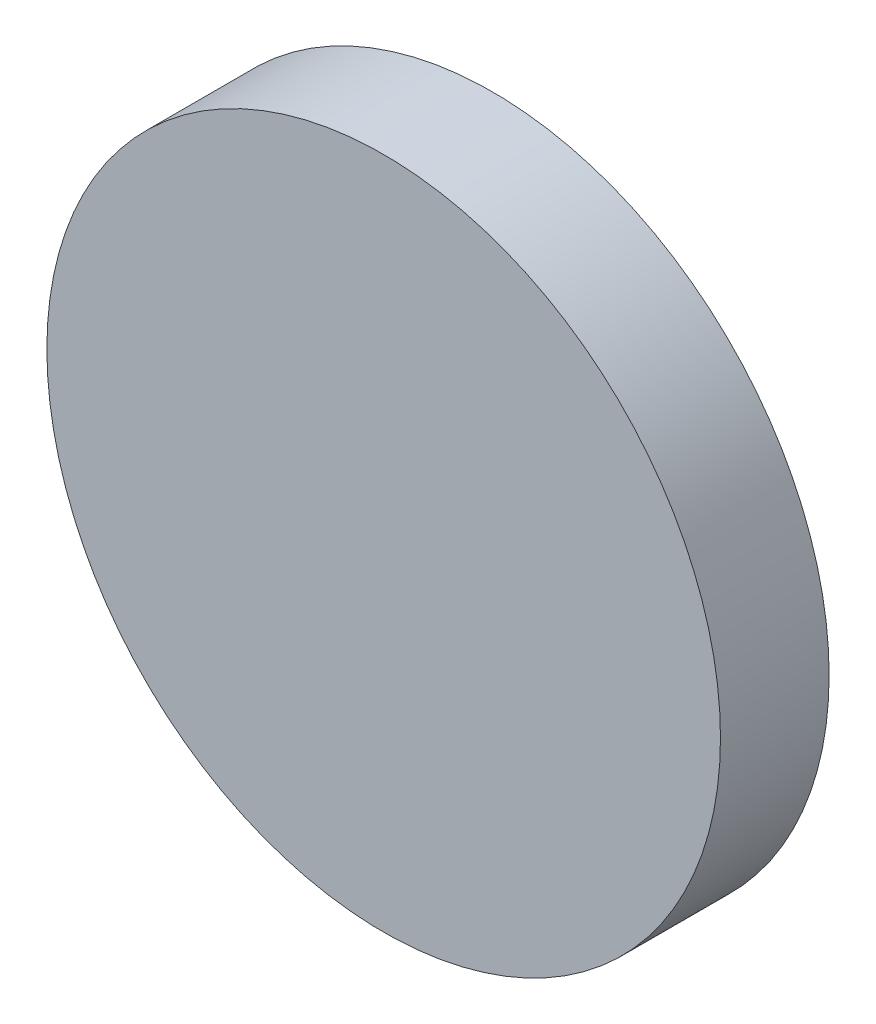
ISO-10303-21;
HEADER;
FILE_DESCRIPTION(('STEP AP214'),'2;1');
FILE_NAME('part.step','',(''),(''),'','','');
FILE_SCHEMA(('AUTOMOTIVE_DESIGN { 1 0 10303 214 1 1 1 1 }'));
ENDSEC;
DATA;
#1=APPLICATION_CONTEXT('core data for automotive mechanical design processes');
#2=APPLICATION_PROTOCOL_DEFINITION('international standard','automotive_design',2000,#1);
#3=PRODUCT_CONTEXT('',#1,'mechanical');
#4=PRODUCT('Part','Part','',(#3));
#5=PRODUCT_RELATED_PRODUCT_CATEGORY('part','',(#4));
#6=PRODUCT_DEFINITION_FORMATION('','',#4);
#7=PRODUCT_DEFINITION_CONTEXT('part definition',#1,'design');
#8=PRODUCT_DEFINITION('design','',#6,#7);
#9=PRODUCT_DEFINITION_SHAPE('','',#8);
#10=(LENGTH_UNIT() NAMED_UNIT(*) SI_UNIT(.MILLI.,.METRE.));
#11=(NAMED_UNIT(*) PLANE_ANGLE_UNIT() SI_UNIT($,.RADIAN.));
#12=(NAMED_UNIT(*) SI_UNIT($,.STERADIAN.) SOLID_ANGLE_UNIT());
#13=UNCERTAINTY_MEASURE_WITH_UNIT(LENGTH_MEASURE(1.E-05),#10,'distance_accuracy_value','');
#14=(GEOMETRIC_REPRESENTATION_CONTEXT(3) GLOBAL_UNCERTAINTY_ASSIGNED_CONTEXT((#13)) GLOBAL_UNIT_ASSIGNED_CONTEXT((#10,
#11,#12)) REPRESENTATION_CONTEXT('',''));
#15=CARTESIAN_POINT('',(0.,0.,0.));
#16=DIRECTION('',(0.,0.,1.));
#17=DIRECTION('',(1.,0.,0.));
#18=AXIS2_PLACEMENT_3D('',#15,#16,#17);
#19=CARTESIAN_POINT('',(0.,0.,-5.));
#20=DIRECTION('',(0.,0.,1.));
#21=DIRECTION('',(1.,0.,0.));
#22=AXIS2_PLACEMENT_3D('',#19,#20,#21);
#23=CYLINDRICAL_SURFACE('',#22,15.5);
#24=CARTESIAN_POINT('',(0.,0.,-5.));
#25=DIRECTION('',(0.,0.,1.));
#26=DIRECTION('',(1.,0.,0.));
#27=AXIS2_PLACEMENT_3D('',#24,#25,#26);
#28=CIRCLE('',#27,15.5);
#29=CARTESIAN_POINT('',(15.5,0.,-5.));
#30=VERTEX_POINT('',#29);
#31=EDGE_CURVE('E10',#30,#30,#28,.T.);
#32=ORIENTED_EDGE('',*,*,#31,.T.);
#33=EDGE_LOOP('',(#32));
#34=FACE_BOUND('',#33,.T.);
#35=CARTESIAN_POINT('',(0.,0.,0.));
#36=DIRECTION('',(0.,0.,1.));
#37=DIRECTION('',(1.,0.,0.));
#38=AXIS2_PLACEMENT_3D('',#35,#36,#37);
#39=CIRCLE('',#38,15.5);
#40=CARTESIAN_POINT('',(15.5,0.,0.));
#41=VERTEX_POINT('',#40);
#42=EDGE_CURVE('E44',#41,#41,#39,.T.);
#43=ORIENTED_EDGE('',*,*,#42,.F.);
#44=EDGE_LOOP('',(#43));
#45=FACE_BOUND('',#44,.T.);
#46=ADVANCED_FACE('F41',(#34,#45),#23,.T.);
#47=CARTESIAN_POINT('',(0.,0.,-5.));
#48=DIRECTION('',(0.,0.,1.));
#49=DIRECTION('',(1.,0.,0.));
#50=AXIS2_PLACEMENT_3D('',#47,#48,#49);
#51=PLANE('',#50);
#52=ORIENTED_EDGE('',*,*,#31,.F.);
#53=EDGE_LOOP('',(#52));
#54=FACE_BOUND('',#53,.T.);
#55=ADVANCED_FACE('F56',(#54),#51,.F.);
#56=CARTESIAN_POINT('',(0.,0.,0.));
#57=DIRECTION('',(0.,0.,1.));
#58=DIRECTION('',(1.,0.,0.));
#59=AXIS2_PLACEMENT_3D('',#56,#57,#58);
#60=PLANE('',#59);
#61=ORIENTED_EDGE('',*,*,#42,.T.);
#62=EDGE_LOOP('',(#61));
#63=FACE_BOUND('',#62,.T.);
#64=ADVANCED_FACE('F53',(#63),#60,.T.);
#65=CLOSED_SHELL('',(#46,#55,#64));
#66=MANIFOLD_SOLID_BREP('B2',#65);
#67=ADVANCED_BREP_SHAPE_REPRESENTATION('',(#18,#66),#14);
#68=SHAPE_DEFINITION_REPRESENTATION(#9,#67);
ENDSEC;
END-ISO-10303-21;
